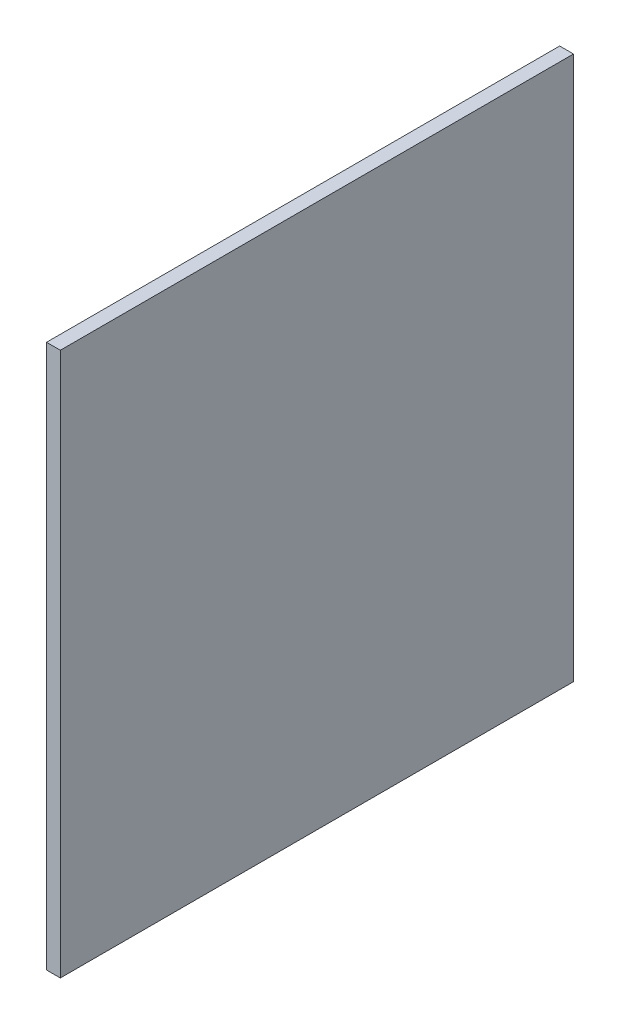
ISO-10303-21;
HEADER;
FILE_DESCRIPTION(('STEP AP214'),'2;1');
FILE_NAME('part.step','',(''),(''),'','','');
FILE_SCHEMA(('AUTOMOTIVE_DESIGN { 1 0 10303 214 1 1 1 1 }'));
ENDSEC;
DATA;
#1=APPLICATION_CONTEXT('core data for automotive mechanical design processes');
#2=APPLICATION_PROTOCOL_DEFINITION('international standard','automotive_design',2000,#1);
#3=PRODUCT_CONTEXT('',#1,'mechanical');
#4=PRODUCT('Part','Part','',(#3));
#5=PRODUCT_RELATED_PRODUCT_CATEGORY('part','',(#4));
#6=PRODUCT_DEFINITION_FORMATION('','',#4);
#7=PRODUCT_DEFINITION_CONTEXT('part definition',#1,'design');
#8=PRODUCT_DEFINITION('design','',#6,#7);
#9=PRODUCT_DEFINITION_SHAPE('','',#8);
#10=(LENGTH_UNIT() NAMED_UNIT(*) SI_UNIT(.MILLI.,.METRE.));
#11=(NAMED_UNIT(*) PLANE_ANGLE_UNIT() SI_UNIT($,.RADIAN.));
#12=(NAMED_UNIT(*) SI_UNIT($,.STERADIAN.) SOLID_ANGLE_UNIT());
#13=UNCERTAINTY_MEASURE_WITH_UNIT(LENGTH_MEASURE(1.E-05),#10,'distance_accuracy_value','');
#14=(GEOMETRIC_REPRESENTATION_CONTEXT(3) GLOBAL_UNCERTAINTY_ASSIGNED_CONTEXT((#13)) GLOBAL_UNIT_ASSIGNED_CONTEXT((#10,
#11,#12)) REPRESENTATION_CONTEXT('',''));
#15=CARTESIAN_POINT('',(0.,0.,0.));
#16=DIRECTION('',(0.,0.,1.));
#17=DIRECTION('',(1.,0.,0.));
#18=AXIS2_PLACEMENT_3D('',#15,#16,#17);
#19=CARTESIAN_POINT('',(9.52500000000001,0.,0.));
#20=DIRECTION('',(0.,0.,-1.));
#21=DIRECTION('',(-1.,0.,0.));
#22=AXIS2_PLACEMENT_3D('',#19,#20,#21);
#23=PLANE('',#22);
#24=DIRECTION('',(0.,-1.,0.));
#25=VECTOR('',#24,1.);
#26=CARTESIAN_POINT('',(0.,0.,0.));
#27=LINE('',#26,#25);
#28=CARTESIAN_POINT('',(0.,375.,0.));
#29=VERTEX_POINT('',#28);
#30=CARTESIAN_POINT('',(0.,0.,0.));
#31=VERTEX_POINT('',#30);
#32=EDGE_CURVE('E100',#29,#31,#27,.T.);
#33=ORIENTED_EDGE('',*,*,#32,.T.);
#34=DIRECTION('',(-1.,0.,0.));
#35=VECTOR('',#34,1.);
#36=CARTESIAN_POINT('',(9.52500000000001,0.,0.));
#37=LINE('',#36,#35);
#38=CARTESIAN_POINT('',(9.52500000000001,0.,0.));
#39=VERTEX_POINT('',#38);
#40=EDGE_CURVE('E11',#39,#31,#37,.T.);
#41=ORIENTED_EDGE('',*,*,#40,.F.);
#42=DIRECTION('',(0.,-1.,0.));
#43=VECTOR('',#42,1.);
#44=CARTESIAN_POINT('',(9.52500000000001,0.,0.));
#45=LINE('',#44,#43);
#46=CARTESIAN_POINT('',(9.52500000000001,375.,0.));
#47=VERTEX_POINT('',#46);
#48=EDGE_CURVE('E88',#47,#39,#45,.T.);
#49=ORIENTED_EDGE('',*,*,#48,.F.);
#50=DIRECTION('',(-1.,0.,0.));
#51=VECTOR('',#50,1.);
#52=CARTESIAN_POINT('',(9.52500000000001,375.,0.));
#53=LINE('',#52,#51);
#54=EDGE_CURVE('E96',#47,#29,#53,.T.);
#55=ORIENTED_EDGE('',*,*,#54,.T.);
#56=EDGE_LOOP('',(#33,#41,#49,#55));
#57=FACE_BOUND('',#56,.T.);
#58=ADVANCED_FACE('F37',(#57),#23,.F.);
#59=CARTESIAN_POINT('',(9.52500000000001,0.,0.));
#60=DIRECTION('',(0.,1.,0.));
#61=DIRECTION('',(0.,0.,1.));
#62=AXIS2_PLACEMENT_3D('',#59,#60,#61);
#63=PLANE('',#62);
#64=DIRECTION('',(0.,0.,-1.));
#65=VECTOR('',#64,1.);
#66=CARTESIAN_POINT('',(0.,0.,0.));
#67=LINE('',#66,#65);
#68=CARTESIAN_POINT('',(0.,0.,-353.95));
#69=VERTEX_POINT('',#68);
#70=EDGE_CURVE('E92',#31,#69,#67,.T.);
#71=ORIENTED_EDGE('',*,*,#70,.T.);
#72=DIRECTION('',(-1.,0.,0.));
#73=VECTOR('',#72,1.);
#74=CARTESIAN_POINT('',(9.52500000000002,0.,-353.95));
#75=LINE('',#74,#73);
#76=CARTESIAN_POINT('',(9.52500000000002,0.,-353.95));
#77=VERTEX_POINT('',#76);
#78=EDGE_CURVE('E45',#77,#69,#75,.T.);
#79=ORIENTED_EDGE('',*,*,#78,.F.);
#80=DIRECTION('',(0.,0.,-1.));
#81=VECTOR('',#80,1.);
#82=CARTESIAN_POINT('',(9.52500000000001,0.,0.));
#83=LINE('',#82,#81);
#84=EDGE_CURVE('E83',#39,#77,#83,.T.);
#85=ORIENTED_EDGE('',*,*,#84,.F.);
#86=ORIENTED_EDGE('',*,*,#40,.T.);
#87=EDGE_LOOP('',(#71,#79,#85,#86));
#88=FACE_BOUND('',#87,.T.);
#89=ADVANCED_FACE('F91',(#88),#63,.F.);
#90=CARTESIAN_POINT('',(9.52500000000002,0.,-353.95));
#91=DIRECTION('',(0.,0.,1.));
#92=DIRECTION('',(1.,0.,0.));
#93=AXIS2_PLACEMENT_3D('',#90,#91,#92);
#94=PLANE('',#93);
#95=DIRECTION('',(0.,1.,0.));
#96=VECTOR('',#95,1.);
#97=CARTESIAN_POINT('',(0.,0.,-353.95));
#98=LINE('',#97,#96);
#99=CARTESIAN_POINT('',(0.,375.,-353.95));
#100=VERTEX_POINT('',#99);
#101=EDGE_CURVE('E70',#69,#100,#98,.T.);
#102=ORIENTED_EDGE('',*,*,#101,.T.);
#103=DIRECTION('',(-1.,0.,0.));
#104=VECTOR('',#103,1.);
#105=CARTESIAN_POINT('',(9.52500000000002,375.,-353.95));
#106=LINE('',#105,#104);
#107=CARTESIAN_POINT('',(9.52500000000002,375.,-353.95));
#108=VERTEX_POINT('',#107);
#109=EDGE_CURVE('E93',#108,#100,#106,.T.);
#110=ORIENTED_EDGE('',*,*,#109,.F.);
#111=DIRECTION('',(0.,1.,0.));
#112=VECTOR('',#111,1.);
#113=CARTESIAN_POINT('',(9.52500000000002,0.,-353.95));
#114=LINE('',#113,#112);
#115=EDGE_CURVE('E86',#77,#108,#114,.T.);
#116=ORIENTED_EDGE('',*,*,#115,.F.);
#117=ORIENTED_EDGE('',*,*,#78,.T.);
#118=EDGE_LOOP('',(#102,#110,#116,#117));
#119=FACE_BOUND('',#118,.T.);
#120=ADVANCED_FACE('F94',(#119),#94,.F.);
#121=CARTESIAN_POINT('',(9.52500000000001,375.,0.));
#122=DIRECTION('',(0.,-1.,0.));
#123=DIRECTION('',(0.,0.,-1.));
#124=AXIS2_PLACEMENT_3D('',#121,#122,#123);
#125=PLANE('',#124);
#126=DIRECTION('',(0.,0.,1.));
#127=VECTOR('',#126,1.);
#128=CARTESIAN_POINT('',(0.,375.,0.));
#129=LINE('',#128,#127);
#130=EDGE_CURVE('E76',#100,#29,#129,.T.);
#131=ORIENTED_EDGE('',*,*,#130,.T.);
#132=ORIENTED_EDGE('',*,*,#54,.F.);
#133=DIRECTION('',(0.,0.,1.));
#134=VECTOR('',#133,1.);
#135=CARTESIAN_POINT('',(9.52500000000001,375.,0.));
#136=LINE('',#135,#134);
#137=EDGE_CURVE('E53',#108,#47,#136,.T.);
#138=ORIENTED_EDGE('',*,*,#137,.F.);
#139=ORIENTED_EDGE('',*,*,#109,.T.);
#140=EDGE_LOOP('',(#131,#132,#138,#139));
#141=FACE_BOUND('',#140,.T.);
#142=ADVANCED_FACE('F107',(#141),#125,.F.);
#143=CARTESIAN_POINT('',(9.52500000000001,0.,0.));
#144=DIRECTION('',(-1.,0.,0.));
#145=DIRECTION('',(0.,0.,1.));
#146=AXIS2_PLACEMENT_3D('',#143,#144,#145);
#147=PLANE('',#146);
#148=ORIENTED_EDGE('',*,*,#48,.T.);
#149=ORIENTED_EDGE('',*,*,#84,.T.);
#150=ORIENTED_EDGE('',*,*,#115,.T.);
#151=ORIENTED_EDGE('',*,*,#137,.T.);
#152=EDGE_LOOP('',(#148,#149,#150,#151));
#153=FACE_BOUND('',#152,.T.);
#154=ADVANCED_FACE('F84',(#153),#147,.F.);
#155=CARTESIAN_POINT('',(0.,0.,0.));
#156=DIRECTION('',(-1.,0.,0.));
#157=DIRECTION('',(0.,0.,1.));
#158=AXIS2_PLACEMENT_3D('',#155,#156,#157);
#159=PLANE('',#158);
#160=ORIENTED_EDGE('',*,*,#32,.F.);
#161=ORIENTED_EDGE('',*,*,#130,.F.);
#162=ORIENTED_EDGE('',*,*,#101,.F.);
#163=ORIENTED_EDGE('',*,*,#70,.F.);
#164=EDGE_LOOP('',(#160,#161,#162,#163));
#165=FACE_BOUND('',#164,.T.);
#166=ADVANCED_FACE('F110',(#165),#159,.T.);
#167=CLOSED_SHELL('',(#58,#89,#120,#142,#154,#166));
#168=MANIFOLD_SOLID_BREP('B2',#167);
#169=ADVANCED_BREP_SHAPE_REPRESENTATION('',(#18,#168),#14);
#170=SHAPE_DEFINITION_REPRESENTATION(#9,#169);
ENDSEC;
END-ISO-10303-21;
